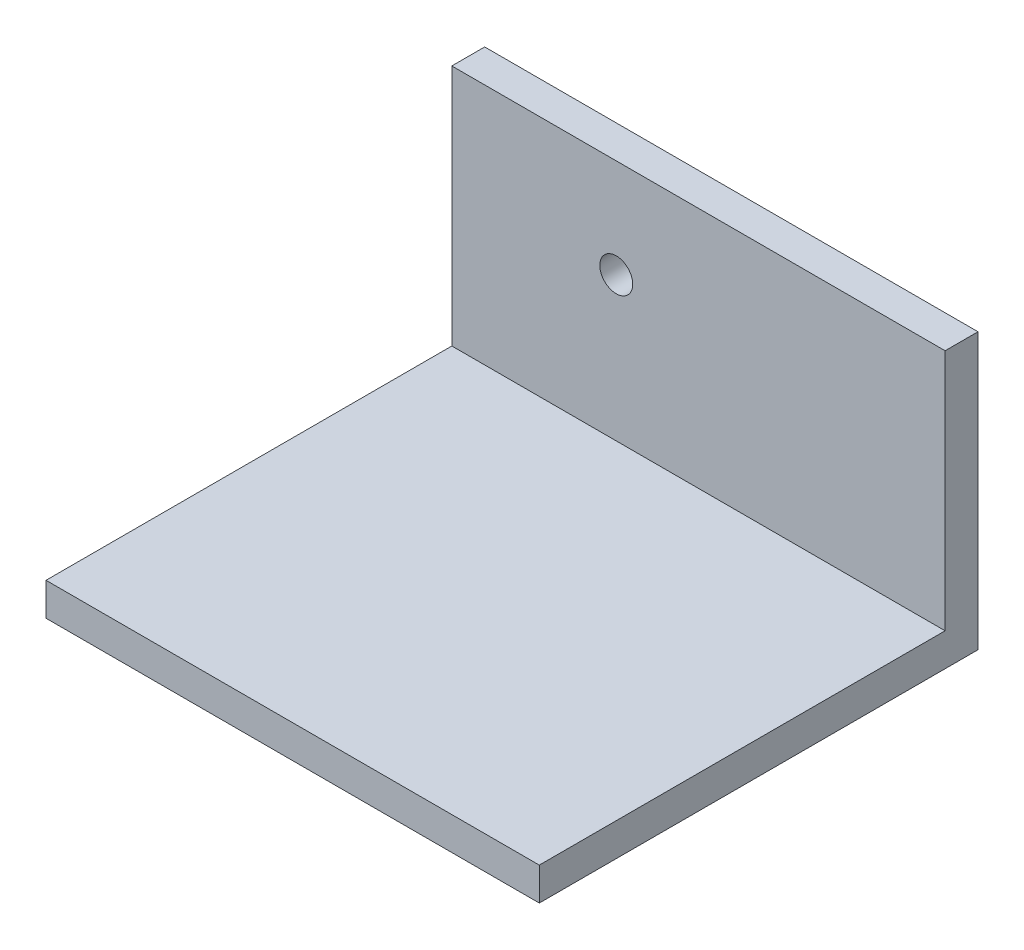
ISO-10303-21;
HEADER;
FILE_DESCRIPTION(('STEP AP214'),'2;1');
FILE_NAME('part.step','',(''),(''),'','','');
FILE_SCHEMA(('AUTOMOTIVE_DESIGN { 1 0 10303 214 1 1 1 1 }'));
ENDSEC;
DATA;
#1=APPLICATION_CONTEXT('core data for automotive mechanical design processes');
#2=APPLICATION_PROTOCOL_DEFINITION('international standard','automotive_design',2000,#1);
#3=PRODUCT_CONTEXT('',#1,'mechanical');
#4=PRODUCT('Part','Part','',(#3));
#5=PRODUCT_RELATED_PRODUCT_CATEGORY('part','',(#4));
#6=PRODUCT_DEFINITION_FORMATION('','',#4);
#7=PRODUCT_DEFINITION_CONTEXT('part definition',#1,'design');
#8=PRODUCT_DEFINITION('design','',#6,#7);
#9=PRODUCT_DEFINITION_SHAPE('','',#8);
#10=(LENGTH_UNIT() NAMED_UNIT(*) SI_UNIT(.MILLI.,.METRE.));
#11=(NAMED_UNIT(*) PLANE_ANGLE_UNIT() SI_UNIT($,.RADIAN.));
#12=(NAMED_UNIT(*) SI_UNIT($,.STERADIAN.) SOLID_ANGLE_UNIT());
#13=UNCERTAINTY_MEASURE_WITH_UNIT(LENGTH_MEASURE(1.E-05),#10,'distance_accuracy_value','');
#14=(GEOMETRIC_REPRESENTATION_CONTEXT(3) GLOBAL_UNCERTAINTY_ASSIGNED_CONTEXT((#13)) GLOBAL_UNIT_ASSIGNED_CONTEXT((#10,
#11,#12)) REPRESENTATION_CONTEXT('',''));
#15=CARTESIAN_POINT('',(0.,0.,0.));
#16=DIRECTION('',(0.,0.,1.));
#17=DIRECTION('',(1.,0.,0.));
#18=AXIS2_PLACEMENT_3D('',#15,#16,#17);
#19=CARTESIAN_POINT('',(0.,0.,7.));
#20=DIRECTION('',(0.,0.,1.));
#21=DIRECTION('',(1.,0.,0.));
#22=AXIS2_PLACEMENT_3D('',#19,#20,#21);
#23=PLANE('',#22);
#24=CARTESIAN_POINT('',(0.,0.,7.));
#25=DIRECTION('',(0.,0.,1.));
#26=DIRECTION('',(1.,0.,0.));
#27=AXIS2_PLACEMENT_3D('',#24,#25,#26);
#28=CIRCLE('',#27,2.);
#29=CARTESIAN_POINT('',(2.,0.,7.));
#30=VERTEX_POINT('',#29);
#31=EDGE_CURVE('E102',#30,#30,#28,.T.);
#32=ORIENTED_EDGE('',*,*,#31,.F.);
#33=EDGE_LOOP('',(#32));
#34=FACE_BOUND('',#33,.T.);
#35=DIRECTION('',(0.,-1.,0.));
#36=VECTOR('',#35,1.);
#37=CARTESIAN_POINT('',(-20.,12.,7.));
#38=LINE('',#37,#36);
#39=CARTESIAN_POINT('',(-20.,12.,7.));
#40=VERTEX_POINT('',#39);
#41=CARTESIAN_POINT('',(-20.,-17.5,7.));
#42=VERTEX_POINT('',#41);
#43=EDGE_CURVE('E93',#40,#42,#38,.T.);
#44=ORIENTED_EDGE('',*,*,#43,.T.);
#45=DIRECTION('',(1.,0.,0.));
#46=VECTOR('',#45,1.);
#47=CARTESIAN_POINT('',(0.,-17.5,7.));
#48=LINE('',#47,#46);
#49=CARTESIAN_POINT('',(40.,-17.5,7.));
#50=VERTEX_POINT('',#49);
#51=EDGE_CURVE('E11',#42,#50,#48,.T.);
#52=ORIENTED_EDGE('',*,*,#51,.T.);
#53=DIRECTION('',(0.,1.,0.));
#54=VECTOR('',#53,1.);
#55=CARTESIAN_POINT('',(40.,-21.5,7.));
#56=LINE('',#55,#54);
#57=CARTESIAN_POINT('',(40.,12.,7.));
#58=VERTEX_POINT('',#57);
#59=EDGE_CURVE('E153',#50,#58,#56,.T.);
#60=ORIENTED_EDGE('',*,*,#59,.T.);
#61=DIRECTION('',(-1.,0.,0.));
#62=VECTOR('',#61,1.);
#63=CARTESIAN_POINT('',(40.,12.,7.));
#64=LINE('',#63,#62);
#65=EDGE_CURVE('E65',#58,#40,#64,.T.);
#66=ORIENTED_EDGE('',*,*,#65,.T.);
#67=EDGE_LOOP('',(#44,#52,#60,#66));
#68=FACE_BOUND('',#67,.T.);
#69=ADVANCED_FACE('F39',(#34,#68),#23,.T.);
#70=CARTESIAN_POINT('',(0.,0.,3.));
#71=DIRECTION('',(0.,0.,1.));
#72=DIRECTION('',(1.,0.,0.));
#73=AXIS2_PLACEMENT_3D('',#70,#71,#72);
#74=PLANE('',#73);
#75=DIRECTION('',(-1.,0.,0.));
#76=VECTOR('',#75,1.);
#77=CARTESIAN_POINT('',(40.,12.,3.));
#78=LINE('',#77,#76);
#79=CARTESIAN_POINT('',(40.,12.,3.));
#80=VERTEX_POINT('',#79);
#81=CARTESIAN_POINT('',(-20.,12.,3.));
#82=VERTEX_POINT('',#81);
#83=EDGE_CURVE('E81',#80,#82,#78,.T.);
#84=ORIENTED_EDGE('',*,*,#83,.F.);
#85=DIRECTION('',(0.,1.,0.));
#86=VECTOR('',#85,1.);
#87=CARTESIAN_POINT('',(40.,-21.5,3.));
#88=LINE('',#87,#86);
#89=CARTESIAN_POINT('',(40.,-21.5,3.));
#90=VERTEX_POINT('',#89);
#91=EDGE_CURVE('E95',#90,#80,#88,.T.);
#92=ORIENTED_EDGE('',*,*,#91,.F.);
#93=DIRECTION('',(1.,0.,0.));
#94=VECTOR('',#93,1.);
#95=CARTESIAN_POINT('',(-20.,-21.5,3.));
#96=LINE('',#95,#94);
#97=CARTESIAN_POINT('',(-20.,-21.5,3.));
#98=VERTEX_POINT('',#97);
#99=EDGE_CURVE('E105',#98,#90,#96,.T.);
#100=ORIENTED_EDGE('',*,*,#99,.F.);
#101=DIRECTION('',(0.,-1.,0.));
#102=VECTOR('',#101,1.);
#103=CARTESIAN_POINT('',(-20.,12.,3.));
#104=LINE('',#103,#102);
#105=EDGE_CURVE('E96',#82,#98,#104,.T.);
#106=ORIENTED_EDGE('',*,*,#105,.F.);
#107=EDGE_LOOP('',(#84,#92,#100,#106));
#108=FACE_BOUND('',#107,.T.);
#109=CARTESIAN_POINT('',(0.,0.,3.));
#110=DIRECTION('',(0.,0.,1.));
#111=DIRECTION('',(1.,0.,0.));
#112=AXIS2_PLACEMENT_3D('',#109,#110,#111);
#113=CIRCLE('',#112,2.);
#114=CARTESIAN_POINT('',(2.,0.,3.));
#115=VERTEX_POINT('',#114);
#116=EDGE_CURVE('E107',#115,#115,#113,.T.);
#117=ORIENTED_EDGE('',*,*,#116,.T.);
#118=EDGE_LOOP('',(#117));
#119=FACE_BOUND('',#118,.T.);
#120=ADVANCED_FACE('F99',(#108,#119),#74,.F.);
#121=CARTESIAN_POINT('',(-20.,12.,7.));
#122=DIRECTION('',(1.,0.,0.));
#123=DIRECTION('',(0.,0.,-1.));
#124=AXIS2_PLACEMENT_3D('',#121,#122,#123);
#125=PLANE('',#124);
#126=ORIENTED_EDGE('',*,*,#105,.T.);
#127=DIRECTION('',(0.,0.,-1.));
#128=VECTOR('',#127,1.);
#129=CARTESIAN_POINT('',(-20.,-21.5,7.));
#130=LINE('',#129,#128);
#131=CARTESIAN_POINT('',(-20.,-21.5,56.36));
#132=VERTEX_POINT('',#131);
#133=EDGE_CURVE('E50',#132,#98,#130,.T.);
#134=ORIENTED_EDGE('',*,*,#133,.F.);
#135=DIRECTION('',(0.,-1.,0.));
#136=VECTOR('',#135,1.);
#137=CARTESIAN_POINT('',(-20.,-17.5,56.36));
#138=LINE('',#137,#136);
#139=CARTESIAN_POINT('',(-20.,-17.5,56.36));
#140=VERTEX_POINT('',#139);
#141=EDGE_CURVE('E130',#140,#132,#138,.T.);
#142=ORIENTED_EDGE('',*,*,#141,.F.);
#143=DIRECTION('',(0.,0.,1.));
#144=VECTOR('',#143,1.);
#145=CARTESIAN_POINT('',(-20.,-17.5,56.36));
#146=LINE('',#145,#144);
#147=EDGE_CURVE('E137',#42,#140,#146,.T.);
#148=ORIENTED_EDGE('',*,*,#147,.F.);
#149=ORIENTED_EDGE('',*,*,#43,.F.);
#150=DIRECTION('',(0.,0.,-1.));
#151=VECTOR('',#150,1.);
#152=CARTESIAN_POINT('',(-20.,12.,7.));
#153=LINE('',#152,#151);
#154=EDGE_CURVE('E83',#40,#82,#153,.T.);
#155=ORIENTED_EDGE('',*,*,#154,.T.);
#156=EDGE_LOOP('',(#126,#134,#142,#148,#149,#155));
#157=FACE_BOUND('',#156,.T.);
#158=ADVANCED_FACE('F41',(#157),#125,.F.);
#159=CARTESIAN_POINT('',(-20.,-21.5,7.));
#160=DIRECTION('',(0.,1.,0.));
#161=DIRECTION('',(0.,0.,1.));
#162=AXIS2_PLACEMENT_3D('',#159,#160,#161);
#163=PLANE('',#162);
#164=ORIENTED_EDGE('',*,*,#99,.T.);
#165=DIRECTION('',(0.,0.,-1.));
#166=VECTOR('',#165,1.);
#167=CARTESIAN_POINT('',(40.,-21.5,7.));
#168=LINE('',#167,#166);
#169=CARTESIAN_POINT('',(40.,-21.5,56.36));
#170=VERTEX_POINT('',#169);
#171=EDGE_CURVE('E113',#170,#90,#168,.T.);
#172=ORIENTED_EDGE('',*,*,#171,.F.);
#173=DIRECTION('',(1.,0.,0.));
#174=VECTOR('',#173,1.);
#175=CARTESIAN_POINT('',(40.,-21.5,56.36));
#176=LINE('',#175,#174);
#177=EDGE_CURVE('E122',#132,#170,#176,.T.);
#178=ORIENTED_EDGE('',*,*,#177,.F.);
#179=ORIENTED_EDGE('',*,*,#133,.T.);
#180=EDGE_LOOP('',(#164,#172,#178,#179));
#181=FACE_BOUND('',#180,.T.);
#182=ADVANCED_FACE('F116',(#181),#163,.F.);
#183=CARTESIAN_POINT('',(40.,-21.5,7.));
#184=DIRECTION('',(-1.,0.,0.));
#185=DIRECTION('',(0.,0.,1.));
#186=AXIS2_PLACEMENT_3D('',#183,#184,#185);
#187=PLANE('',#186);
#188=ORIENTED_EDGE('',*,*,#59,.F.);
#189=DIRECTION('',(0.,0.,-1.));
#190=VECTOR('',#189,1.);
#191=CARTESIAN_POINT('',(40.,-17.5,3.));
#192=LINE('',#191,#190);
#193=CARTESIAN_POINT('',(40.,-17.5,56.36));
#194=VERTEX_POINT('',#193);
#195=EDGE_CURVE('E53',#194,#50,#192,.T.);
#196=ORIENTED_EDGE('',*,*,#195,.F.);
#197=DIRECTION('',(0.,-1.,0.));
#198=VECTOR('',#197,1.);
#199=CARTESIAN_POINT('',(40.,-17.5,56.36));
#200=LINE('',#199,#198);
#201=EDGE_CURVE('E145',#194,#170,#200,.T.);
#202=ORIENTED_EDGE('',*,*,#201,.T.);
#203=ORIENTED_EDGE('',*,*,#171,.T.);
#204=ORIENTED_EDGE('',*,*,#91,.T.);
#205=DIRECTION('',(0.,0.,-1.));
#206=VECTOR('',#205,1.);
#207=CARTESIAN_POINT('',(40.,12.,7.));
#208=LINE('',#207,#206);
#209=EDGE_CURVE('E87',#58,#80,#208,.T.);
#210=ORIENTED_EDGE('',*,*,#209,.F.);
#211=EDGE_LOOP('',(#188,#196,#202,#203,#204,#210));
#212=FACE_BOUND('',#211,.T.);
#213=ADVANCED_FACE('F156',(#212),#187,.F.);
#214=CARTESIAN_POINT('',(40.,12.,7.));
#215=DIRECTION('',(0.,-1.,0.));
#216=DIRECTION('',(0.,0.,-1.));
#217=AXIS2_PLACEMENT_3D('',#214,#215,#216);
#218=PLANE('',#217);
#219=ORIENTED_EDGE('',*,*,#83,.T.);
#220=ORIENTED_EDGE('',*,*,#154,.F.);
#221=ORIENTED_EDGE('',*,*,#65,.F.);
#222=ORIENTED_EDGE('',*,*,#209,.T.);
#223=EDGE_LOOP('',(#219,#220,#221,#222));
#224=FACE_BOUND('',#223,.T.);
#225=ADVANCED_FACE('F82',(#224),#218,.F.);
#226=CARTESIAN_POINT('',(0.,0.,7.));
#227=DIRECTION('',(0.,0.,-1.));
#228=DIRECTION('',(-1.,0.,0.));
#229=AXIS2_PLACEMENT_3D('',#226,#227,#228);
#230=CYLINDRICAL_SURFACE('',#229,2.);
#231=ORIENTED_EDGE('',*,*,#31,.T.);
#232=EDGE_LOOP('',(#231));
#233=FACE_BOUND('',#232,.T.);
#234=ORIENTED_EDGE('',*,*,#116,.F.);
#235=EDGE_LOOP('',(#234));
#236=FACE_BOUND('',#235,.T.);
#237=ADVANCED_FACE('F163',(#233,#236),#230,.F.);
#238=CARTESIAN_POINT('',(40.,-17.5,56.36));
#239=DIRECTION('',(0.,0.,-1.));
#240=DIRECTION('',(-1.,0.,0.));
#241=AXIS2_PLACEMENT_3D('',#238,#239,#240);
#242=PLANE('',#241);
#243=ORIENTED_EDGE('',*,*,#177,.T.);
#244=ORIENTED_EDGE('',*,*,#201,.F.);
#245=DIRECTION('',(1.,0.,0.));
#246=VECTOR('',#245,1.);
#247=CARTESIAN_POINT('',(40.,-17.5,56.36));
#248=LINE('',#247,#246);
#249=EDGE_CURVE('E136',#140,#194,#248,.T.);
#250=ORIENTED_EDGE('',*,*,#249,.F.);
#251=ORIENTED_EDGE('',*,*,#141,.T.);
#252=EDGE_LOOP('',(#243,#244,#250,#251));
#253=FACE_BOUND('',#252,.T.);
#254=ADVANCED_FACE('F142',(#253),#242,.F.);
#255=CARTESIAN_POINT('',(0.,-17.5,0.));
#256=DIRECTION('',(0.,-1.,0.));
#257=DIRECTION('',(0.,0.,-1.));
#258=AXIS2_PLACEMENT_3D('',#255,#256,#257);
#259=PLANE('',#258);
#260=ORIENTED_EDGE('',*,*,#51,.F.);
#261=ORIENTED_EDGE('',*,*,#147,.T.);
#262=ORIENTED_EDGE('',*,*,#249,.T.);
#263=ORIENTED_EDGE('',*,*,#195,.T.);
#264=EDGE_LOOP('',(#260,#261,#262,#263));
#265=FACE_BOUND('',#264,.T.);
#266=ADVANCED_FACE('F138',(#265),#259,.F.);
#267=CLOSED_SHELL('',(#69,#120,#158,#182,#213,#225,#237,#254,#266));
#268=MANIFOLD_SOLID_BREP('B2',#267);
#269=ADVANCED_BREP_SHAPE_REPRESENTATION('',(#18,#268),#14);
#270=SHAPE_DEFINITION_REPRESENTATION(#9,#269);
ENDSEC;
END-ISO-10303-21;
